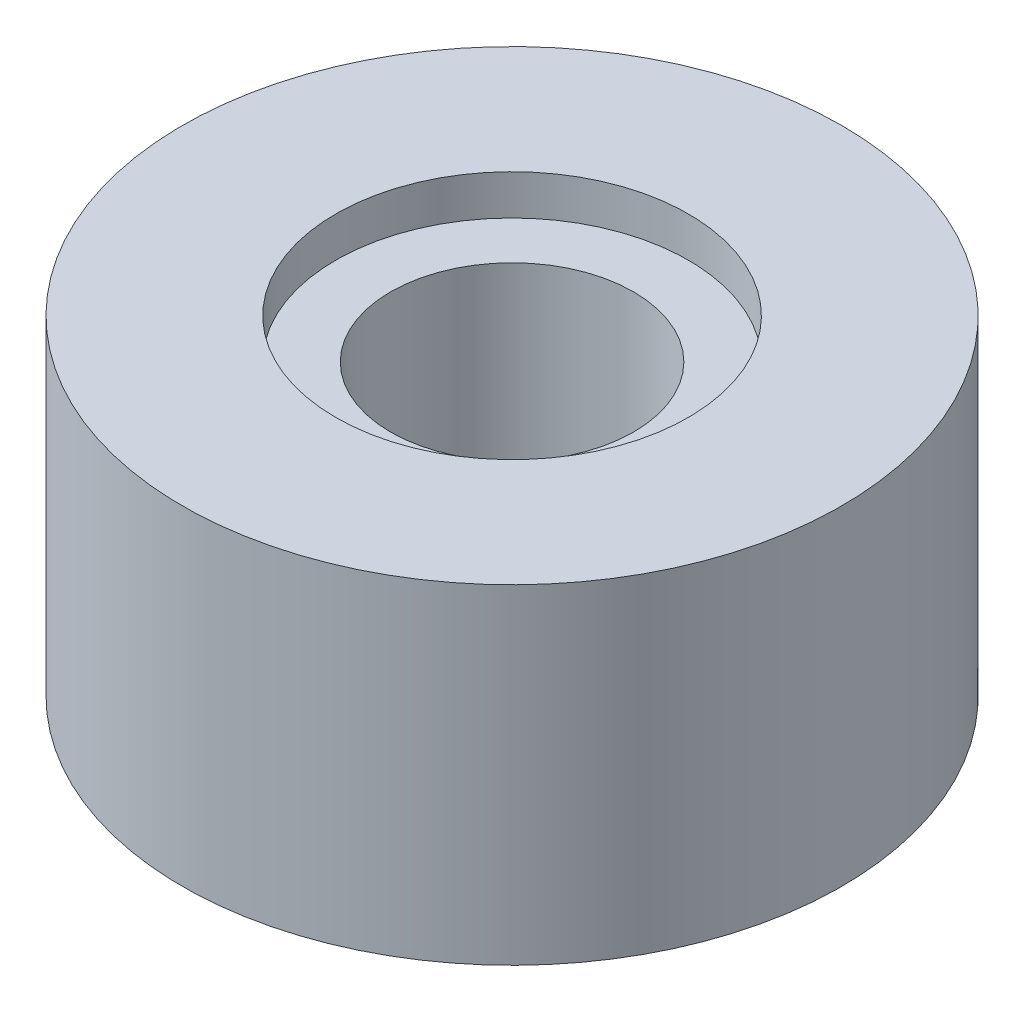
ISO-10303-21;
HEADER;
FILE_DESCRIPTION(('STEP AP214'),'2;1');
FILE_NAME('part.step','',(''),(''),'','','');
FILE_SCHEMA(('AUTOMOTIVE_DESIGN { 1 0 10303 214 1 1 1 1 }'));
ENDSEC;
DATA;
#1=APPLICATION_CONTEXT('core data for automotive mechanical design processes');
#2=APPLICATION_PROTOCOL_DEFINITION('international standard','automotive_design',2000,#1);
#3=PRODUCT_CONTEXT('',#1,'mechanical');
#4=PRODUCT('Part','Part','',(#3));
#5=PRODUCT_RELATED_PRODUCT_CATEGORY('part','',(#4));
#6=PRODUCT_DEFINITION_FORMATION('','',#4);
#7=PRODUCT_DEFINITION_CONTEXT('part definition',#1,'design');
#8=PRODUCT_DEFINITION('design','',#6,#7);
#9=PRODUCT_DEFINITION_SHAPE('','',#8);
#10=(LENGTH_UNIT() NAMED_UNIT(*) SI_UNIT(.MILLI.,.METRE.));
#11=(NAMED_UNIT(*) PLANE_ANGLE_UNIT() SI_UNIT($,.RADIAN.));
#12=(NAMED_UNIT(*) SI_UNIT($,.STERADIAN.) SOLID_ANGLE_UNIT());
#13=UNCERTAINTY_MEASURE_WITH_UNIT(LENGTH_MEASURE(1.E-05),#10,'distance_accuracy_value','');
#14=(GEOMETRIC_REPRESENTATION_CONTEXT(3) GLOBAL_UNCERTAINTY_ASSIGNED_CONTEXT((#13)) GLOBAL_UNIT_ASSIGNED_CONTEXT((#10,
#11,#12)) REPRESENTATION_CONTEXT('',''));
#15=CARTESIAN_POINT('',(0.,0.,0.));
#16=DIRECTION('',(0.,0.,1.));
#17=DIRECTION('',(1.,0.,0.));
#18=AXIS2_PLACEMENT_3D('',#15,#16,#17);
#19=CARTESIAN_POINT('',(0.,76.2,0.));
#20=DIRECTION('',(0.,-1.,0.));
#21=DIRECTION('',(0.,0.,-1.));
#22=AXIS2_PLACEMENT_3D('',#19,#20,#21);
#23=CYLINDRICAL_SURFACE('',#22,14.0462);
#24=CARTESIAN_POINT('',(0.,33.46704,0.));
#25=DIRECTION('',(0.,1.,0.));
#26=DIRECTION('',(0.,0.,1.));
#27=AXIS2_PLACEMENT_3D('',#24,#25,#26);
#28=CIRCLE('',#27,14.0462);
#29=CARTESIAN_POINT('',(0.,33.46704,-14.0462));
#30=VERTEX_POINT('',#29);
#31=EDGE_CURVE('E56',#30,#30,#28,.F.);
#32=CARTESIAN_POINT('',(0.,12.7,0.));
#33=DIRECTION('',(0.,-1.,0.));
#34=DIRECTION('',(0.,0.,-1.));
#35=AXIS2_PLACEMENT_3D('',#32,#33,#34);
#36=CIRCLE('',#35,14.0462);
#37=CARTESIAN_POINT('',(0.,12.7,-14.0462));
#38=VERTEX_POINT('',#37);
#39=EDGE_CURVE('E45',#38,#38,#36,.F.);
#40=CARTESIAN_POINT('',(0.,33.46704,-14.0462));
#41=CARTESIAN_POINT('',(0.,33.2507166666667,-14.0462));
#42=CARTESIAN_POINT('',(0.,33.0343933333333,-14.0462));
#43=CARTESIAN_POINT('',(0.,32.6017466666667,-14.0462));
#44=CARTESIAN_POINT('',(0.,32.3854233333333,-14.0462));
#45=CARTESIAN_POINT('',(0.,31.9527766666667,-14.0462));
#46=CARTESIAN_POINT('',(0.,31.7364533333333,-14.0462));
#47=CARTESIAN_POINT('',(0.,31.3038066666667,-14.0462));
#48=CARTESIAN_POINT('',(0.,31.0874833333333,-14.0462));
#49=CARTESIAN_POINT('',(0.,30.6548366666667,-14.0462));
#50=CARTESIAN_POINT('',(0.,30.4385133333333,-14.0462));
#51=CARTESIAN_POINT('',(0.,30.0058666666667,-14.0462));
#52=CARTESIAN_POINT('',(0.,29.7895433333333,-14.0462));
#53=CARTESIAN_POINT('',(0.,29.3568966666667,-14.0462));
#54=CARTESIAN_POINT('',(0.,29.1405733333333,-14.0462));
#55=CARTESIAN_POINT('',(0.,28.7079266666667,-14.0462));
#56=CARTESIAN_POINT('',(0.,28.4916033333333,-14.0462));
#57=CARTESIAN_POINT('',(0.,28.0589566666667,-14.0462));
#58=CARTESIAN_POINT('',(0.,27.8426333333333,-14.0462));
#59=CARTESIAN_POINT('',(0.,27.4099866666667,-14.0462));
#60=CARTESIAN_POINT('',(0.,27.1936633333333,-14.0462));
#61=CARTESIAN_POINT('',(0.,26.7610166666667,-14.0462));
#62=CARTESIAN_POINT('',(0.,26.5446933333333,-14.0462));
#63=CARTESIAN_POINT('',(0.,26.1120466666667,-14.0462));
#64=CARTESIAN_POINT('',(0.,25.8957233333333,-14.0462));
#65=CARTESIAN_POINT('',(0.,25.4630766666667,-14.0462));
#66=CARTESIAN_POINT('',(0.,25.2467533333333,-14.0462));
#67=CARTESIAN_POINT('',(0.,24.8141066666667,-14.0462));
#68=CARTESIAN_POINT('',(0.,24.5977833333333,-14.0462));
#69=CARTESIAN_POINT('',(0.,24.1651366666667,-14.0462));
#70=CARTESIAN_POINT('',(0.,23.9488133333333,-14.0462));
#71=CARTESIAN_POINT('',(0.,23.5161666666667,-14.0462));
#72=CARTESIAN_POINT('',(0.,23.2998433333333,-14.0462));
#73=CARTESIAN_POINT('',(0.,22.8671966666667,-14.0462));
#74=CARTESIAN_POINT('',(0.,22.6508733333333,-14.0462));
#75=CARTESIAN_POINT('',(0.,22.2182266666667,-14.0462));
#76=CARTESIAN_POINT('',(0.,22.0019033333333,-14.0462));
#77=CARTESIAN_POINT('',(0.,21.5692566666667,-14.0462));
#78=CARTESIAN_POINT('',(0.,21.3529333333333,-14.0462));
#79=CARTESIAN_POINT('',(0.,20.9202866666667,-14.0462));
#80=CARTESIAN_POINT('',(0.,20.7039633333333,-14.0462));
#81=CARTESIAN_POINT('',(0.,20.2713166666667,-14.0462));
#82=CARTESIAN_POINT('',(0.,20.0549933333333,-14.0462));
#83=CARTESIAN_POINT('',(0.,19.6223466666667,-14.0462));
#84=CARTESIAN_POINT('',(0.,19.4060233333333,-14.0462));
#85=CARTESIAN_POINT('',(0.,18.9733766666667,-14.0462));
#86=CARTESIAN_POINT('',(0.,18.7570533333333,-14.0462));
#87=CARTESIAN_POINT('',(0.,18.3244066666667,-14.0462));
#88=CARTESIAN_POINT('',(0.,18.1080833333333,-14.0462));
#89=CARTESIAN_POINT('',(0.,17.6754366666667,-14.0462));
#90=CARTESIAN_POINT('',(0.,17.4591133333333,-14.0462));
#91=CARTESIAN_POINT('',(0.,17.0264666666667,-14.0462));
#92=CARTESIAN_POINT('',(0.,16.8101433333333,-14.0462));
#93=CARTESIAN_POINT('',(0.,16.3774966666667,-14.0462));
#94=CARTESIAN_POINT('',(0.,16.1611733333333,-14.0462));
#95=CARTESIAN_POINT('',(0.,15.7285266666667,-14.0462));
#96=CARTESIAN_POINT('',(0.,15.5122033333333,-14.0462));
#97=CARTESIAN_POINT('',(0.,15.0795566666667,-14.0462));
#98=CARTESIAN_POINT('',(0.,14.8632333333333,-14.0462));
#99=CARTESIAN_POINT('',(0.,14.4305866666667,-14.0462));
#100=CARTESIAN_POINT('',(0.,14.2142633333333,-14.0462));
#101=CARTESIAN_POINT('',(0.,13.7816166666667,-14.0462));
#102=CARTESIAN_POINT('',(0.,13.5652933333333,-14.0462));
#103=CARTESIAN_POINT('',(0.,13.1326466666667,-14.0462));
#104=CARTESIAN_POINT('',(0.,12.9163233333333,-14.0462));
#105=CARTESIAN_POINT('',(0.,12.7,-14.0462));
#106=B_SPLINE_CURVE_WITH_KNOTS('',3,(#40,#41,#42,#43,#44,#45,#46,#47,#48,#49,#50,#51,#52,#53,
#54,#55,#56,#57,#58,#59,#60,#61,#62,#63,#64,#65,#66,#67,#68,#69,#70,#71,#72,#73,#74,#75,#76,#77,
#78,#79,#80,#81,#82,#83,#84,#85,#86,#87,#88,#89,#90,#91,#92,#93,#94,#95,#96,#97,#98,#99,#100,
#101,#102,#103,#104,#105),.UNSPECIFIED.,.F.,.F.,(4,2,2,2,2,2,2,2,2,2,2,2,2,2,2,2,2,2,2,2,2,2,2,
2,2,2,2,2,2,2,2,2,4),(0.,0.648969999999999,1.29794,1.94691,2.59587999999999,3.24485,3.89382,
4.54279,5.19176,5.84073,6.48969999999999,7.13866999999999,7.78764,8.43661,9.08558,9.73455,
10.38352,11.03249,11.68146,12.33043,12.9794,13.62837,14.27734,14.92631,15.57528,16.22425,
16.87322,17.52219,18.17116,18.82013,19.4691,20.11807,20.76704),.UNSPECIFIED.);
#107=EDGE_CURVE('BSEAM41',#30,#38,#106,.T.);
#108=ORIENTED_EDGE('',*,*,#31,.F.);
#109=ORIENTED_EDGE('',*,*,#39,.F.);
#110=ORIENTED_EDGE('',*,*,#107,.T.);
#111=ORIENTED_EDGE('',*,*,#107,.F.);
#112=EDGE_LOOP('',(#108,#110,#109,#111));
#113=FACE_BOUND('',#112,.T.);
#114=ADVANCED_FACE('F41',(#113),#23,.F.);
#115=CARTESIAN_POINT('',(0.,38.1,0.));
#116=DIRECTION('',(0.,-1.,0.));
#117=DIRECTION('',(0.,0.,-1.));
#118=AXIS2_PLACEMENT_3D('',#115,#116,#117);
#119=CYLINDRICAL_SURFACE('',#118,38.1);
#120=CARTESIAN_POINT('',(0.,38.1,0.));
#121=DIRECTION('',(0.,1.,0.));
#122=DIRECTION('',(0.,0.,1.));
#123=AXIS2_PLACEMENT_3D('',#120,#121,#122);
#124=CIRCLE('',#123,38.1);
#125=CARTESIAN_POINT('',(0.,38.1,-38.1));
#126=VERTEX_POINT('',#125);
#127=EDGE_CURVE('E10',#126,#126,#124,.T.);
#128=CARTESIAN_POINT('',(0.,0.,0.));
#129=DIRECTION('',(0.,1.,0.));
#130=DIRECTION('',(0.,0.,1.));
#131=AXIS2_PLACEMENT_3D('',#128,#129,#130);
#132=CIRCLE('',#131,38.1);
#133=CARTESIAN_POINT('',(0.,0.,-38.1));
#134=VERTEX_POINT('',#133);
#135=EDGE_CURVE('E50',#134,#134,#132,.T.);
#136=CARTESIAN_POINT('',(0.,38.1,-38.1));
#137=CARTESIAN_POINT('',(0.,37.703125,-38.1));
#138=CARTESIAN_POINT('',(0.,37.30625,-38.1));
#139=CARTESIAN_POINT('',(0.,36.5125,-38.1));
#140=CARTESIAN_POINT('',(0.,36.115625,-38.1));
#141=CARTESIAN_POINT('',(0.,35.321875,-38.1));
#142=CARTESIAN_POINT('',(0.,34.925,-38.1));
#143=CARTESIAN_POINT('',(0.,34.13125,-38.1));
#144=CARTESIAN_POINT('',(0.,33.734375,-38.1));
#145=CARTESIAN_POINT('',(0.,32.940625,-38.1));
#146=CARTESIAN_POINT('',(0.,32.54375,-38.1));
#147=CARTESIAN_POINT('',(0.,31.75,-38.1));
#148=CARTESIAN_POINT('',(0.,31.353125,-38.1));
#149=CARTESIAN_POINT('',(0.,30.559375,-38.1));
#150=CARTESIAN_POINT('',(0.,30.1625,-38.1));
#151=CARTESIAN_POINT('',(0.,29.36875,-38.1));
#152=CARTESIAN_POINT('',(0.,28.971875,-38.1));
#153=CARTESIAN_POINT('',(0.,28.178125,-38.1));
#154=CARTESIAN_POINT('',(0.,27.78125,-38.1));
#155=CARTESIAN_POINT('',(0.,26.9875,-38.1));
#156=CARTESIAN_POINT('',(0.,26.590625,-38.1));
#157=CARTESIAN_POINT('',(0.,25.796875,-38.1));
#158=CARTESIAN_POINT('',(0.,25.4,-38.1));
#159=CARTESIAN_POINT('',(0.,24.60625,-38.1));
#160=CARTESIAN_POINT('',(0.,24.209375,-38.1));
#161=CARTESIAN_POINT('',(0.,23.415625,-38.1));
#162=CARTESIAN_POINT('',(0.,23.01875,-38.1));
#163=CARTESIAN_POINT('',(0.,22.225,-38.1));
#164=CARTESIAN_POINT('',(0.,21.828125,-38.1));
#165=CARTESIAN_POINT('',(0.,21.034375,-38.1));
#166=CARTESIAN_POINT('',(0.,20.6375,-38.1));
#167=CARTESIAN_POINT('',(0.,19.84375,-38.1));
#168=CARTESIAN_POINT('',(0.,19.446875,-38.1));
#169=CARTESIAN_POINT('',(0.,18.653125,-38.1));
#170=CARTESIAN_POINT('',(0.,18.25625,-38.1));
#171=CARTESIAN_POINT('',(0.,17.4625,-38.1));
#172=CARTESIAN_POINT('',(0.,17.065625,-38.1));
#173=CARTESIAN_POINT('',(0.,16.271875,-38.1));
#174=CARTESIAN_POINT('',(0.,15.875,-38.1));
#175=CARTESIAN_POINT('',(0.,15.08125,-38.1));
#176=CARTESIAN_POINT('',(0.,14.684375,-38.1));
#177=CARTESIAN_POINT('',(0.,13.890625,-38.1));
#178=CARTESIAN_POINT('',(0.,13.49375,-38.1));
#179=CARTESIAN_POINT('',(0.,12.7,-38.1));
#180=CARTESIAN_POINT('',(0.,12.303125,-38.1));
#181=CARTESIAN_POINT('',(0.,11.509375,-38.1));
#182=CARTESIAN_POINT('',(0.,11.1125,-38.1));
#183=CARTESIAN_POINT('',(0.,10.31875,-38.1));
#184=CARTESIAN_POINT('',(0.,9.92187499999999,-38.1));
#185=CARTESIAN_POINT('',(0.,9.128125,-38.1));
#186=CARTESIAN_POINT('',(0.,8.73124999999999,-38.1));
#187=CARTESIAN_POINT('',(0.,7.93749999999999,-38.1));
#188=CARTESIAN_POINT('',(0.,7.54062499999999,-38.1));
#189=CARTESIAN_POINT('',(0.,6.746875,-38.1));
#190=CARTESIAN_POINT('',(0.,6.35,-38.1));
#191=CARTESIAN_POINT('',(0.,5.55625,-38.1));
#192=CARTESIAN_POINT('',(0.,5.159375,-38.1));
#193=CARTESIAN_POINT('',(0.,4.365625,-38.1));
#194=CARTESIAN_POINT('',(0.,3.96875,-38.1));
#195=CARTESIAN_POINT('',(0.,3.175,-38.1));
#196=CARTESIAN_POINT('',(0.,2.778125,-38.1));
#197=CARTESIAN_POINT('',(0.,1.984375,-38.1));
#198=CARTESIAN_POINT('',(0.,1.5875,-38.1));
#199=CARTESIAN_POINT('',(0.,0.79375,-38.1));
#200=CARTESIAN_POINT('',(0.,0.396875,-38.1));
#201=CARTESIAN_POINT('',(0.,0.,-38.1));
#202=B_SPLINE_CURVE_WITH_KNOTS('',3,(#136,#137,#138,#139,#140,#141,#142,#143,#144,#145,#146,
#147,#148,#149,#150,#151,#152,#153,#154,#155,#156,#157,#158,#159,#160,#161,#162,#163,#164,#165,
#166,#167,#168,#169,#170,#171,#172,#173,#174,#175,#176,#177,#178,#179,#180,#181,#182,#183,#184,
#185,#186,#187,#188,#189,#190,#191,#192,#193,#194,#195,#196,#197,#198,#199,#200,#201),
.UNSPECIFIED.,.F.,.F.,(4,2,2,2,2,2,2,2,2,2,2,2,2,2,2,2,2,2,2,2,2,2,2,2,2,2,2,2,2,2,2,2,4),(0.,
1.190625,2.38125,3.571875,4.7625,5.953125,7.14375,8.334375,9.52500000000001,10.715625,11.90625,
13.096875,14.2875,15.478125,16.66875,17.859375,19.05,20.240625,21.43125,22.621875,23.8125,
25.003125,26.19375,27.384375,28.575,29.765625,30.95625,32.146875,33.3375,34.528125,35.71875,
36.909375,38.1),.UNSPECIFIED.);
#203=EDGE_CURVE('BSEAM43',#126,#134,#202,.T.);
#204=ORIENTED_EDGE('',*,*,#127,.F.);
#205=ORIENTED_EDGE('',*,*,#135,.T.);
#206=ORIENTED_EDGE('',*,*,#203,.T.);
#207=ORIENTED_EDGE('',*,*,#203,.F.);
#208=EDGE_LOOP('',(#204,#206,#205,#207));
#209=FACE_BOUND('',#208,.T.);
#210=ADVANCED_FACE('F43',(#209),#119,.T.);
#211=CARTESIAN_POINT('',(0.,38.1,0.));
#212=DIRECTION('',(0.,1.,0.));
#213=DIRECTION('',(0.,0.,1.));
#214=AXIS2_PLACEMENT_3D('',#211,#212,#213);
#215=PLANE('',#214);
#216=CARTESIAN_POINT('',(0.,38.1,0.));
#217=DIRECTION('',(0.,1.,0.));
#218=DIRECTION('',(0.,0.,1.));
#219=AXIS2_PLACEMENT_3D('',#216,#217,#218);
#220=CIRCLE('',#219,20.3835);
#221=CARTESIAN_POINT('',(0.,38.1,20.3835));
#222=VERTEX_POINT('',#221);
#223=EDGE_CURVE('E59',#222,#222,#220,.T.);
#224=ORIENTED_EDGE('',*,*,#223,.F.);
#225=EDGE_LOOP('',(#224));
#226=FACE_BOUND('',#225,.T.);
#227=ORIENTED_EDGE('',*,*,#127,.T.);
#228=EDGE_LOOP('',(#227));
#229=FACE_BOUND('',#228,.T.);
#230=ADVANCED_FACE('F94',(#226,#229),#215,.T.);
#231=CARTESIAN_POINT('',(0.,0.,0.));
#232=DIRECTION('',(0.,1.,0.));
#233=DIRECTION('',(0.,0.,1.));
#234=AXIS2_PLACEMENT_3D('',#231,#232,#233);
#235=PLANE('',#234);
#236=CARTESIAN_POINT('',(0.,0.,0.));
#237=DIRECTION('',(0.,-1.,0.));
#238=DIRECTION('',(0.,0.,-1.));
#239=AXIS2_PLACEMENT_3D('',#236,#237,#238);
#240=CIRCLE('',#239,30.0355);
#241=CARTESIAN_POINT('',(0.,0.,-30.0355));
#242=VERTEX_POINT('',#241);
#243=EDGE_CURVE('E73',#242,#242,#240,.T.);
#244=ORIENTED_EDGE('',*,*,#243,.F.);
#245=EDGE_LOOP('',(#244));
#246=FACE_BOUND('',#245,.T.);
#247=ORIENTED_EDGE('',*,*,#135,.F.);
#248=EDGE_LOOP('',(#247));
#249=FACE_BOUND('',#248,.T.);
#250=ADVANCED_FACE('F101',(#246,#249),#235,.F.);
#251=CARTESIAN_POINT('',(0.,33.46704,0.));
#252=DIRECTION('',(0.,1.,0.));
#253=DIRECTION('',(0.,0.,1.));
#254=AXIS2_PLACEMENT_3D('',#251,#252,#253);
#255=PLANE('',#254);
#256=CARTESIAN_POINT('',(0.,33.46704,0.));
#257=DIRECTION('',(0.,1.,0.));
#258=DIRECTION('',(0.,0.,1.));
#259=AXIS2_PLACEMENT_3D('',#256,#257,#258);
#260=CIRCLE('',#259,20.3835);
#261=CARTESIAN_POINT('',(0.,33.46704,20.3835));
#262=VERTEX_POINT('',#261);
#263=EDGE_CURVE('E63',#262,#262,#260,.T.);
#264=ORIENTED_EDGE('',*,*,#263,.T.);
#265=EDGE_LOOP('',(#264));
#266=FACE_BOUND('',#265,.T.);
#267=ORIENTED_EDGE('',*,*,#31,.T.);
#268=EDGE_LOOP('',(#267));
#269=FACE_BOUND('',#268,.T.);
#270=ADVANCED_FACE('F104',(#266,#269),#255,.T.);
#271=CARTESIAN_POINT('',(0.,33.46704,0.));
#272=DIRECTION('',(0.,1.,0.));
#273=DIRECTION('',(0.,0.,1.));
#274=AXIS2_PLACEMENT_3D('',#271,#272,#273);
#275=CYLINDRICAL_SURFACE('',#274,20.3835);
#276=ORIENTED_EDGE('',*,*,#263,.F.);
#277=EDGE_LOOP('',(#276));
#278=FACE_BOUND('',#277,.T.);
#279=ORIENTED_EDGE('',*,*,#223,.T.);
#280=EDGE_LOOP('',(#279));
#281=FACE_BOUND('',#280,.T.);
#282=ADVANCED_FACE('F98',(#278,#281),#275,.F.);
#283=CARTESIAN_POINT('',(0.,12.7,0.));
#284=DIRECTION('',(0.,-1.,0.));
#285=DIRECTION('',(0.,0.,-1.));
#286=AXIS2_PLACEMENT_3D('',#283,#284,#285);
#287=PLANE('',#286);
#288=CARTESIAN_POINT('',(0.,12.7,0.));
#289=DIRECTION('',(0.,-1.,0.));
#290=DIRECTION('',(0.,0.,-1.));
#291=AXIS2_PLACEMENT_3D('',#288,#289,#290);
#292=CIRCLE('',#291,30.0355);
#293=CARTESIAN_POINT('',(0.,12.7,-30.0355));
#294=VERTEX_POINT('',#293);
#295=EDGE_CURVE('E77',#294,#294,#292,.T.);
#296=ORIENTED_EDGE('',*,*,#295,.T.);
#297=EDGE_LOOP('',(#296));
#298=FACE_BOUND('',#297,.T.);
#299=ORIENTED_EDGE('',*,*,#39,.T.);
#300=EDGE_LOOP('',(#299));
#301=FACE_BOUND('',#300,.T.);
#302=ADVANCED_FACE('F86',(#298,#301),#287,.T.);
#303=CARTESIAN_POINT('',(0.,12.7,0.));
#304=DIRECTION('',(0.,-1.,0.));
#305=DIRECTION('',(0.,0.,-1.));
#306=AXIS2_PLACEMENT_3D('',#303,#304,#305);
#307=CYLINDRICAL_SURFACE('',#306,30.0355);
#308=ORIENTED_EDGE('',*,*,#295,.F.);
#309=EDGE_LOOP('',(#308));
#310=FACE_BOUND('',#309,.T.);
#311=ORIENTED_EDGE('',*,*,#243,.T.);
#312=EDGE_LOOP('',(#311));
#313=FACE_BOUND('',#312,.T.);
#314=ADVANCED_FACE('F114',(#310,#313),#307,.F.);
#315=CLOSED_SHELL('',(#114,#210,#230,#250,#270,#282,#302,#314));
#316=MANIFOLD_SOLID_BREP('B2',#315);
#317=ADVANCED_BREP_SHAPE_REPRESENTATION('',(#18,#316),#14);
#318=SHAPE_DEFINITION_REPRESENTATION(#9,#317);
ENDSEC;
END-ISO-10303-21;
